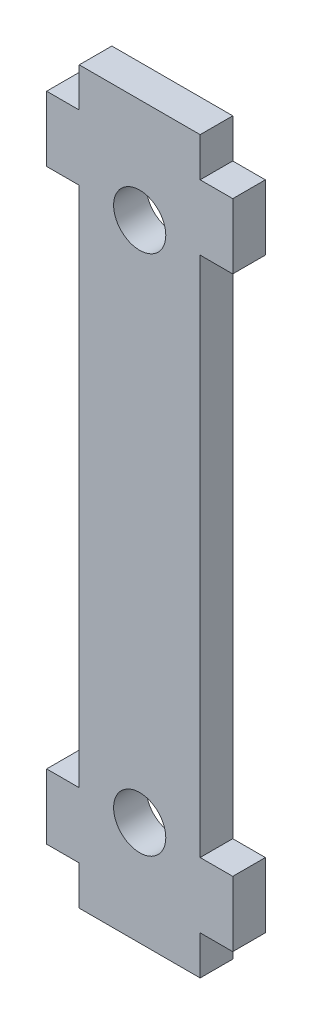
ISO-10303-21;
HEADER;
FILE_DESCRIPTION(('STEP AP214'),'2;1');
FILE_NAME('part.step','',(''),(''),'','','');
FILE_SCHEMA(('AUTOMOTIVE_DESIGN { 1 0 10303 214 1 1 1 1 }'));
ENDSEC;
DATA;
#1=APPLICATION_CONTEXT('core data for automotive mechanical design processes');
#2=APPLICATION_PROTOCOL_DEFINITION('international standard','automotive_design',2000,#1);
#3=PRODUCT_CONTEXT('',#1,'mechanical');
#4=PRODUCT('Part','Part','',(#3));
#5=PRODUCT_RELATED_PRODUCT_CATEGORY('part','',(#4));
#6=PRODUCT_DEFINITION_FORMATION('','',#4);
#7=PRODUCT_DEFINITION_CONTEXT('part definition',#1,'design');
#8=PRODUCT_DEFINITION('design','',#6,#7);
#9=PRODUCT_DEFINITION_SHAPE('','',#8);
#10=(LENGTH_UNIT() NAMED_UNIT(*) SI_UNIT(.MILLI.,.METRE.));
#11=(NAMED_UNIT(*) PLANE_ANGLE_UNIT() SI_UNIT($,.RADIAN.));
#12=(NAMED_UNIT(*) SI_UNIT($,.STERADIAN.) SOLID_ANGLE_UNIT());
#13=UNCERTAINTY_MEASURE_WITH_UNIT(LENGTH_MEASURE(1.E-05),#10,'distance_accuracy_value','');
#14=(GEOMETRIC_REPRESENTATION_CONTEXT(3) GLOBAL_UNCERTAINTY_ASSIGNED_CONTEXT((#13)) GLOBAL_UNIT_ASSIGNED_CONTEXT((#10,
#11,#12)) REPRESENTATION_CONTEXT('',''));
#15=CARTESIAN_POINT('',(0.,0.,0.));
#16=DIRECTION('',(0.,0.,1.));
#17=DIRECTION('',(1.,0.,0.));
#18=AXIS2_PLACEMENT_3D('',#15,#16,#17);
#19=CARTESIAN_POINT('',(0.,40.,2.5));
#20=DIRECTION('',(0.,-1.,0.));
#21=DIRECTION('',(0.,0.,-1.));
#22=AXIS2_PLACEMENT_3D('',#19,#20,#21);
#23=PLANE('',#22);
#24=DIRECTION('',(-1.,0.,0.));
#25=VECTOR('',#24,1.);
#26=CARTESIAN_POINT('',(0.,40.,-2.5));
#27=LINE('',#26,#25);
#28=CARTESIAN_POINT('',(-9.26999999999999,40.,-2.5));
#29=VERTEX_POINT('',#28);
#30=CARTESIAN_POINT('',(-14.27,40.,-2.5));
#31=VERTEX_POINT('',#30);
#32=EDGE_CURVE('E207',#29,#31,#27,.T.);
#33=ORIENTED_EDGE('',*,*,#32,.F.);
#34=DIRECTION('',(0.,0.,-1.));
#35=VECTOR('',#34,1.);
#36=CARTESIAN_POINT('',(-9.26999999999999,40.,2.5));
#37=LINE('',#36,#35);
#38=CARTESIAN_POINT('',(-9.26999999999999,40.,2.5));
#39=VERTEX_POINT('',#38);
#40=EDGE_CURVE('E11',#39,#29,#37,.T.);
#41=ORIENTED_EDGE('',*,*,#40,.F.);
#42=DIRECTION('',(-1.,0.,0.));
#43=VECTOR('',#42,1.);
#44=CARTESIAN_POINT('',(0.,40.,2.5));
#45=LINE('',#44,#43);
#46=CARTESIAN_POINT('',(-14.27,40.,2.5));
#47=VERTEX_POINT('',#46);
#48=EDGE_CURVE('E256',#39,#47,#45,.T.);
#49=ORIENTED_EDGE('',*,*,#48,.T.);
#50=DIRECTION('',(0.,0.,-1.));
#51=VECTOR('',#50,1.);
#52=CARTESIAN_POINT('',(-14.27,40.,2.5));
#53=LINE('',#52,#51);
#54=EDGE_CURVE('E57',#47,#31,#53,.T.);
#55=ORIENTED_EDGE('',*,*,#54,.T.);
#56=EDGE_LOOP('',(#33,#41,#49,#55));
#57=FACE_BOUND('',#56,.T.);
#58=ADVANCED_FACE('F41',(#57),#23,.T.);
#59=CARTESIAN_POINT('',(-9.26999999999999,0.,2.5));
#60=DIRECTION('',(1.,0.,0.));
#61=DIRECTION('',(0.,0.,-1.));
#62=AXIS2_PLACEMENT_3D('',#59,#60,#61);
#63=PLANE('',#62);
#64=DIRECTION('',(0.,-1.,0.));
#65=VECTOR('',#64,1.);
#66=CARTESIAN_POINT('',(-9.26999999999999,0.,-2.5));
#67=LINE('',#66,#65);
#68=CARTESIAN_POINT('',(-9.26999999999999,-40.,-2.5));
#69=VERTEX_POINT('',#68);
#70=EDGE_CURVE('E209',#29,#69,#67,.T.);
#71=ORIENTED_EDGE('',*,*,#70,.T.);
#72=DIRECTION('',(0.,0.,-1.));
#73=VECTOR('',#72,1.);
#74=CARTESIAN_POINT('',(-9.26999999999999,-40.,2.5));
#75=LINE('',#74,#73);
#76=CARTESIAN_POINT('',(-9.26999999999999,-40.,2.5));
#77=VERTEX_POINT('',#76);
#78=EDGE_CURVE('E49',#77,#69,#75,.T.);
#79=ORIENTED_EDGE('',*,*,#78,.F.);
#80=DIRECTION('',(0.,-1.,0.));
#81=VECTOR('',#80,1.);
#82=CARTESIAN_POINT('',(-9.26999999999999,0.,2.5));
#83=LINE('',#82,#81);
#84=EDGE_CURVE('E318',#39,#77,#83,.T.);
#85=ORIENTED_EDGE('',*,*,#84,.F.);
#86=ORIENTED_EDGE('',*,*,#40,.T.);
#87=EDGE_LOOP('',(#71,#79,#85,#86));
#88=FACE_BOUND('',#87,.T.);
#89=ADVANCED_FACE('F368',(#88),#63,.F.);
#90=CARTESIAN_POINT('',(0.,-40.,2.5));
#91=DIRECTION('',(0.,-1.,0.));
#92=DIRECTION('',(0.,0.,-1.));
#93=AXIS2_PLACEMENT_3D('',#90,#91,#92);
#94=PLANE('',#93);
#95=DIRECTION('',(-1.,0.,0.));
#96=VECTOR('',#95,1.);
#97=CARTESIAN_POINT('',(0.,-40.,-2.5));
#98=LINE('',#97,#96);
#99=CARTESIAN_POINT('',(-14.27,-40.,-2.5));
#100=VERTEX_POINT('',#99);
#101=EDGE_CURVE('E212',#69,#100,#98,.T.);
#102=ORIENTED_EDGE('',*,*,#101,.T.);
#103=DIRECTION('',(0.,0.,-1.));
#104=VECTOR('',#103,1.);
#105=CARTESIAN_POINT('',(-14.27,-40.,2.5));
#106=LINE('',#105,#104);
#107=CARTESIAN_POINT('',(-14.27,-40.,2.5));
#108=VERTEX_POINT('',#107);
#109=EDGE_CURVE('E292',#108,#100,#106,.T.);
#110=ORIENTED_EDGE('',*,*,#109,.F.);
#111=DIRECTION('',(-1.,0.,0.));
#112=VECTOR('',#111,1.);
#113=CARTESIAN_POINT('',(0.,-40.,2.5));
#114=LINE('',#113,#112);
#115=EDGE_CURVE('E300',#77,#108,#114,.T.);
#116=ORIENTED_EDGE('',*,*,#115,.F.);
#117=ORIENTED_EDGE('',*,*,#78,.T.);
#118=EDGE_LOOP('',(#102,#110,#116,#117));
#119=FACE_BOUND('',#118,.T.);
#120=ADVANCED_FACE('F298',(#119),#94,.F.);
#121=CARTESIAN_POINT('',(-14.2700000000001,0.,2.5));
#122=DIRECTION('',(-1.,0.,0.));
#123=DIRECTION('',(0.,-1.,0.));
#124=AXIS2_PLACEMENT_3D('',#121,#122,#123);
#125=PLANE('',#124);
#126=DIRECTION('',(0.,1.,0.));
#127=VECTOR('',#126,1.);
#128=CARTESIAN_POINT('',(-14.2700000000001,0.,-2.5));
#129=LINE('',#128,#127);
#130=CARTESIAN_POINT('',(-14.27,-50.,-2.5));
#131=VERTEX_POINT('',#130);
#132=EDGE_CURVE('E215',#131,#100,#129,.T.);
#133=ORIENTED_EDGE('',*,*,#132,.F.);
#134=DIRECTION('',(0.,0.,-1.));
#135=VECTOR('',#134,1.);
#136=CARTESIAN_POINT('',(-14.27,-50.,2.5));
#137=LINE('',#136,#135);
#138=CARTESIAN_POINT('',(-14.27,-50.,2.5));
#139=VERTEX_POINT('',#138);
#140=EDGE_CURVE('E290',#139,#131,#137,.T.);
#141=ORIENTED_EDGE('',*,*,#140,.F.);
#142=DIRECTION('',(0.,1.,0.));
#143=VECTOR('',#142,1.);
#144=CARTESIAN_POINT('',(-14.2700000000001,0.,2.5));
#145=LINE('',#144,#143);
#146=EDGE_CURVE('E313',#139,#108,#145,.T.);
#147=ORIENTED_EDGE('',*,*,#146,.T.);
#148=ORIENTED_EDGE('',*,*,#109,.T.);
#149=EDGE_LOOP('',(#133,#141,#147,#148));
#150=FACE_BOUND('',#149,.T.);
#151=ADVANCED_FACE('F309',(#150),#125,.T.);
#152=CARTESIAN_POINT('',(0.,-50.,2.5));
#153=DIRECTION('',(0.,1.,0.));
#154=DIRECTION('',(0.,0.,1.));
#155=AXIS2_PLACEMENT_3D('',#152,#153,#154);
#156=PLANE('',#155);
#157=DIRECTION('',(1.,0.,0.));
#158=VECTOR('',#157,1.);
#159=CARTESIAN_POINT('',(0.,-50.,-2.5));
#160=LINE('',#159,#158);
#161=CARTESIAN_POINT('',(-9.26999999999998,-50.,-2.5));
#162=VERTEX_POINT('',#161);
#163=EDGE_CURVE('E218',#131,#162,#160,.T.);
#164=ORIENTED_EDGE('',*,*,#163,.T.);
#165=DIRECTION('',(0.,0.,-1.));
#166=VECTOR('',#165,1.);
#167=CARTESIAN_POINT('',(-9.26999999999998,-50.,2.5));
#168=LINE('',#167,#166);
#169=CARTESIAN_POINT('',(-9.26999999999998,-50.,2.5));
#170=VERTEX_POINT('',#169);
#171=EDGE_CURVE('E287',#170,#162,#168,.T.);
#172=ORIENTED_EDGE('',*,*,#171,.F.);
#173=DIRECTION('',(1.,0.,0.));
#174=VECTOR('',#173,1.);
#175=CARTESIAN_POINT('',(0.,-50.,2.5));
#176=LINE('',#175,#174);
#177=EDGE_CURVE('E314',#139,#170,#176,.T.);
#178=ORIENTED_EDGE('',*,*,#177,.F.);
#179=ORIENTED_EDGE('',*,*,#140,.T.);
#180=EDGE_LOOP('',(#164,#172,#178,#179));
#181=FACE_BOUND('',#180,.T.);
#182=ADVANCED_FACE('F379',(#181),#156,.F.);
#183=CARTESIAN_POINT('',(-9.26999999999988,0.,2.5));
#184=DIRECTION('',(1.,0.,0.));
#185=DIRECTION('',(0.,1.,0.));
#186=AXIS2_PLACEMENT_3D('',#183,#184,#185);
#187=PLANE('',#186);
#188=DIRECTION('',(0.,-1.,0.));
#189=VECTOR('',#188,1.);
#190=CARTESIAN_POINT('',(-9.26999999999988,0.,-2.5));
#191=LINE('',#190,#189);
#192=CARTESIAN_POINT('',(-9.27,-56.,-2.5));
#193=VERTEX_POINT('',#192);
#194=EDGE_CURVE('E220',#162,#193,#191,.T.);
#195=ORIENTED_EDGE('',*,*,#194,.T.);
#196=DIRECTION('',(0.,0.,-1.));
#197=VECTOR('',#196,1.);
#198=CARTESIAN_POINT('',(-9.27,-56.,2.5));
#199=LINE('',#198,#197);
#200=CARTESIAN_POINT('',(-9.27,-56.,2.5));
#201=VERTEX_POINT('',#200);
#202=EDGE_CURVE('E285',#201,#193,#199,.T.);
#203=ORIENTED_EDGE('',*,*,#202,.F.);
#204=DIRECTION('',(0.,-1.,0.));
#205=VECTOR('',#204,1.);
#206=CARTESIAN_POINT('',(-9.26999999999988,0.,2.5));
#207=LINE('',#206,#205);
#208=EDGE_CURVE('E316',#170,#201,#207,.T.);
#209=ORIENTED_EDGE('',*,*,#208,.F.);
#210=ORIENTED_EDGE('',*,*,#171,.T.);
#211=EDGE_LOOP('',(#195,#203,#209,#210));
#212=FACE_BOUND('',#211,.T.);
#213=ADVANCED_FACE('F382',(#212),#187,.F.);
#214=CARTESIAN_POINT('',(0.,-56.,2.5));
#215=DIRECTION('',(0.,-1.,0.));
#216=DIRECTION('',(0.,0.,-1.));
#217=AXIS2_PLACEMENT_3D('',#214,#215,#216);
#218=PLANE('',#217);
#219=DIRECTION('',(-1.,0.,0.));
#220=VECTOR('',#219,1.);
#221=CARTESIAN_POINT('',(0.,-56.,-2.5));
#222=LINE('',#221,#220);
#223=CARTESIAN_POINT('',(9.27000000000002,-56.,-2.5));
#224=VERTEX_POINT('',#223);
#225=EDGE_CURVE('E223',#224,#193,#222,.T.);
#226=ORIENTED_EDGE('',*,*,#225,.F.);
#227=DIRECTION('',(0.,0.,-1.));
#228=VECTOR('',#227,1.);
#229=CARTESIAN_POINT('',(9.27000000000002,-56.,2.5));
#230=LINE('',#229,#228);
#231=CARTESIAN_POINT('',(9.27000000000002,-56.,2.5));
#232=VERTEX_POINT('',#231);
#233=EDGE_CURVE('E283',#232,#224,#230,.T.);
#234=ORIENTED_EDGE('',*,*,#233,.F.);
#235=DIRECTION('',(-1.,0.,0.));
#236=VECTOR('',#235,1.);
#237=CARTESIAN_POINT('',(0.,-56.,2.5));
#238=LINE('',#237,#236);
#239=EDGE_CURVE('E323',#232,#201,#238,.T.);
#240=ORIENTED_EDGE('',*,*,#239,.T.);
#241=ORIENTED_EDGE('',*,*,#202,.T.);
#242=EDGE_LOOP('',(#226,#234,#240,#241));
#243=FACE_BOUND('',#242,.T.);
#244=ADVANCED_FACE('F386',(#243),#218,.T.);
#245=CARTESIAN_POINT('',(9.26999999999965,0.,2.5));
#246=DIRECTION('',(1.,0.,0.));
#247=DIRECTION('',(0.,1.,0.));
#248=AXIS2_PLACEMENT_3D('',#245,#246,#247);
#249=PLANE('',#248);
#250=DIRECTION('',(0.,-1.,0.));
#251=VECTOR('',#250,1.);
#252=CARTESIAN_POINT('',(9.26999999999965,0.,-2.5));
#253=LINE('',#252,#251);
#254=CARTESIAN_POINT('',(9.26999999999998,-50.,-2.5));
#255=VERTEX_POINT('',#254);
#256=EDGE_CURVE('E226',#255,#224,#253,.T.);
#257=ORIENTED_EDGE('',*,*,#256,.F.);
#258=DIRECTION('',(0.,0.,-1.));
#259=VECTOR('',#258,1.);
#260=CARTESIAN_POINT('',(9.26999999999998,-50.,2.5));
#261=LINE('',#260,#259);
#262=CARTESIAN_POINT('',(9.26999999999998,-50.,2.5));
#263=VERTEX_POINT('',#262);
#264=EDGE_CURVE('E281',#263,#255,#261,.T.);
#265=ORIENTED_EDGE('',*,*,#264,.F.);
#266=DIRECTION('',(0.,-1.,0.));
#267=VECTOR('',#266,1.);
#268=CARTESIAN_POINT('',(9.26999999999965,0.,2.5));
#269=LINE('',#268,#267);
#270=EDGE_CURVE('E326',#263,#232,#269,.T.);
#271=ORIENTED_EDGE('',*,*,#270,.T.);
#272=ORIENTED_EDGE('',*,*,#233,.T.);
#273=EDGE_LOOP('',(#257,#265,#271,#272));
#274=FACE_BOUND('',#273,.T.);
#275=ADVANCED_FACE('F390',(#274),#249,.T.);
#276=CARTESIAN_POINT('',(0.,-50.,2.5));
#277=DIRECTION('',(0.,-1.,0.));
#278=DIRECTION('',(1.,0.,0.));
#279=AXIS2_PLACEMENT_3D('',#276,#277,#278);
#280=PLANE('',#279);
#281=DIRECTION('',(-1.,0.,0.));
#282=VECTOR('',#281,1.);
#283=CARTESIAN_POINT('',(0.,-50.,-2.5));
#284=LINE('',#283,#282);
#285=CARTESIAN_POINT('',(14.27,-50.,-2.5));
#286=VERTEX_POINT('',#285);
#287=EDGE_CURVE('E229',#286,#255,#284,.T.);
#288=ORIENTED_EDGE('',*,*,#287,.F.);
#289=DIRECTION('',(0.,0.,-1.));
#290=VECTOR('',#289,1.);
#291=CARTESIAN_POINT('',(14.27,-50.,2.5));
#292=LINE('',#291,#290);
#293=CARTESIAN_POINT('',(14.27,-50.,2.5));
#294=VERTEX_POINT('',#293);
#295=EDGE_CURVE('E279',#294,#286,#292,.T.);
#296=ORIENTED_EDGE('',*,*,#295,.F.);
#297=DIRECTION('',(-1.,0.,0.));
#298=VECTOR('',#297,1.);
#299=CARTESIAN_POINT('',(0.,-50.,2.5));
#300=LINE('',#299,#298);
#301=EDGE_CURVE('E329',#294,#263,#300,.T.);
#302=ORIENTED_EDGE('',*,*,#301,.T.);
#303=ORIENTED_EDGE('',*,*,#264,.T.);
#304=EDGE_LOOP('',(#288,#296,#302,#303));
#305=FACE_BOUND('',#304,.T.);
#306=ADVANCED_FACE('F394',(#305),#280,.T.);
#307=CARTESIAN_POINT('',(14.2700000000002,0.,2.5));
#308=DIRECTION('',(-1.,0.,0.));
#309=DIRECTION('',(0.,-1.,0.));
#310=AXIS2_PLACEMENT_3D('',#307,#308,#309);
#311=PLANE('',#310);
#312=DIRECTION('',(0.,1.,0.));
#313=VECTOR('',#312,1.);
#314=CARTESIAN_POINT('',(14.2700000000002,0.,-2.5));
#315=LINE('',#314,#313);
#316=CARTESIAN_POINT('',(14.27,-40.,-2.5));
#317=VERTEX_POINT('',#316);
#318=EDGE_CURVE('E232',#286,#317,#315,.T.);
#319=ORIENTED_EDGE('',*,*,#318,.T.);
#320=DIRECTION('',(0.,0.,-1.));
#321=VECTOR('',#320,1.);
#322=CARTESIAN_POINT('',(14.27,-40.,2.5));
#323=LINE('',#322,#321);
#324=CARTESIAN_POINT('',(14.27,-40.,2.5));
#325=VERTEX_POINT('',#324);
#326=EDGE_CURVE('E277',#325,#317,#323,.T.);
#327=ORIENTED_EDGE('',*,*,#326,.F.);
#328=DIRECTION('',(0.,1.,0.));
#329=VECTOR('',#328,1.);
#330=CARTESIAN_POINT('',(14.2700000000002,0.,2.5));
#331=LINE('',#330,#329);
#332=EDGE_CURVE('E332',#294,#325,#331,.T.);
#333=ORIENTED_EDGE('',*,*,#332,.F.);
#334=ORIENTED_EDGE('',*,*,#295,.T.);
#335=EDGE_LOOP('',(#319,#327,#333,#334));
#336=FACE_BOUND('',#335,.T.);
#337=ADVANCED_FACE('F398',(#336),#311,.F.);
#338=CARTESIAN_POINT('',(0.,-40.,2.5));
#339=DIRECTION('',(0.,1.,0.));
#340=DIRECTION('',(-1.,0.,0.));
#341=AXIS2_PLACEMENT_3D('',#338,#339,#340);
#342=PLANE('',#341);
#343=DIRECTION('',(1.,0.,0.));
#344=VECTOR('',#343,1.);
#345=CARTESIAN_POINT('',(0.,-40.,-2.5));
#346=LINE('',#345,#344);
#347=CARTESIAN_POINT('',(9.26999999999999,-40.,-2.5));
#348=VERTEX_POINT('',#347);
#349=EDGE_CURVE('E235',#348,#317,#346,.T.);
#350=ORIENTED_EDGE('',*,*,#349,.F.);
#351=DIRECTION('',(0.,0.,-1.));
#352=VECTOR('',#351,1.);
#353=CARTESIAN_POINT('',(9.26999999999999,-40.,2.5));
#354=LINE('',#353,#352);
#355=CARTESIAN_POINT('',(9.26999999999999,-40.,2.5));
#356=VERTEX_POINT('',#355);
#357=EDGE_CURVE('E275',#356,#348,#354,.T.);
#358=ORIENTED_EDGE('',*,*,#357,.F.);
#359=DIRECTION('',(1.,0.,0.));
#360=VECTOR('',#359,1.);
#361=CARTESIAN_POINT('',(0.,-40.,2.5));
#362=LINE('',#361,#360);
#363=EDGE_CURVE('E334',#356,#325,#362,.T.);
#364=ORIENTED_EDGE('',*,*,#363,.T.);
#365=ORIENTED_EDGE('',*,*,#326,.T.);
#366=EDGE_LOOP('',(#350,#358,#364,#365));
#367=FACE_BOUND('',#366,.T.);
#368=ADVANCED_FACE('F402',(#367),#342,.T.);
#369=CARTESIAN_POINT('',(9.26999999999999,0.,2.5));
#370=DIRECTION('',(-1.,0.,0.));
#371=DIRECTION('',(0.,0.,1.));
#372=AXIS2_PLACEMENT_3D('',#369,#370,#371);
#373=PLANE('',#372);
#374=DIRECTION('',(0.,1.,0.));
#375=VECTOR('',#374,1.);
#376=CARTESIAN_POINT('',(9.26999999999999,0.,-2.5));
#377=LINE('',#376,#375);
#378=CARTESIAN_POINT('',(9.26999999999999,40.,-2.5));
#379=VERTEX_POINT('',#378);
#380=EDGE_CURVE('E238',#348,#379,#377,.T.);
#381=ORIENTED_EDGE('',*,*,#380,.T.);
#382=DIRECTION('',(0.,0.,-1.));
#383=VECTOR('',#382,1.);
#384=CARTESIAN_POINT('',(9.26999999999999,40.,2.5));
#385=LINE('',#384,#383);
#386=CARTESIAN_POINT('',(9.26999999999999,40.,2.5));
#387=VERTEX_POINT('',#386);
#388=EDGE_CURVE('E272',#387,#379,#385,.T.);
#389=ORIENTED_EDGE('',*,*,#388,.F.);
#390=DIRECTION('',(0.,1.,0.));
#391=VECTOR('',#390,1.);
#392=CARTESIAN_POINT('',(9.26999999999999,0.,2.5));
#393=LINE('',#392,#391);
#394=EDGE_CURVE('E337',#356,#387,#393,.T.);
#395=ORIENTED_EDGE('',*,*,#394,.F.);
#396=ORIENTED_EDGE('',*,*,#357,.T.);
#397=EDGE_LOOP('',(#381,#389,#395,#396));
#398=FACE_BOUND('',#397,.T.);
#399=ADVANCED_FACE('F406',(#398),#373,.F.);
#400=CARTESIAN_POINT('',(0.,40.,2.5));
#401=DIRECTION('',(0.,1.,0.));
#402=DIRECTION('',(0.,0.,1.));
#403=AXIS2_PLACEMENT_3D('',#400,#401,#402);
#404=PLANE('',#403);
#405=DIRECTION('',(1.,0.,0.));
#406=VECTOR('',#405,1.);
#407=CARTESIAN_POINT('',(0.,40.,-2.5));
#408=LINE('',#407,#406);
#409=CARTESIAN_POINT('',(14.27,40.,-2.5));
#410=VERTEX_POINT('',#409);
#411=EDGE_CURVE('E240',#379,#410,#408,.T.);
#412=ORIENTED_EDGE('',*,*,#411,.T.);
#413=DIRECTION('',(0.,0.,-1.));
#414=VECTOR('',#413,1.);
#415=CARTESIAN_POINT('',(14.27,40.,2.5));
#416=LINE('',#415,#414);
#417=CARTESIAN_POINT('',(14.27,40.,2.5));
#418=VERTEX_POINT('',#417);
#419=EDGE_CURVE('E269',#418,#410,#416,.T.);
#420=ORIENTED_EDGE('',*,*,#419,.F.);
#421=DIRECTION('',(1.,0.,0.));
#422=VECTOR('',#421,1.);
#423=CARTESIAN_POINT('',(0.,40.,2.5));
#424=LINE('',#423,#422);
#425=EDGE_CURVE('E339',#387,#418,#424,.T.);
#426=ORIENTED_EDGE('',*,*,#425,.F.);
#427=ORIENTED_EDGE('',*,*,#388,.T.);
#428=EDGE_LOOP('',(#412,#420,#426,#427));
#429=FACE_BOUND('',#428,.T.);
#430=ADVANCED_FACE('F410',(#429),#404,.F.);
#431=CARTESIAN_POINT('',(14.2700000000002,0.,2.5));
#432=DIRECTION('',(-1.,0.,0.));
#433=DIRECTION('',(0.,-1.,0.));
#434=AXIS2_PLACEMENT_3D('',#431,#432,#433);
#435=PLANE('',#434);
#436=DIRECTION('',(0.,1.,0.));
#437=VECTOR('',#436,1.);
#438=CARTESIAN_POINT('',(14.2700000000002,0.,-2.5));
#439=LINE('',#438,#437);
#440=CARTESIAN_POINT('',(14.27,50.,-2.5));
#441=VERTEX_POINT('',#440);
#442=EDGE_CURVE('E242',#410,#441,#439,.T.);
#443=ORIENTED_EDGE('',*,*,#442,.T.);
#444=DIRECTION('',(0.,0.,-1.));
#445=VECTOR('',#444,1.);
#446=CARTESIAN_POINT('',(14.27,50.,2.5));
#447=LINE('',#446,#445);
#448=CARTESIAN_POINT('',(14.27,50.,2.5));
#449=VERTEX_POINT('',#448);
#450=EDGE_CURVE('E266',#449,#441,#447,.T.);
#451=ORIENTED_EDGE('',*,*,#450,.F.);
#452=DIRECTION('',(0.,1.,0.));
#453=VECTOR('',#452,1.);
#454=CARTESIAN_POINT('',(14.2700000000002,0.,2.5));
#455=LINE('',#454,#453);
#456=EDGE_CURVE('E341',#418,#449,#455,.T.);
#457=ORIENTED_EDGE('',*,*,#456,.F.);
#458=ORIENTED_EDGE('',*,*,#419,.T.);
#459=EDGE_LOOP('',(#443,#451,#457,#458));
#460=FACE_BOUND('',#459,.T.);
#461=ADVANCED_FACE('F414',(#460),#435,.F.);
#462=CARTESIAN_POINT('',(-1.38777878078144E-13,50.,2.5));
#463=DIRECTION('',(0.,-1.,0.));
#464=DIRECTION('',(1.,0.,0.));
#465=AXIS2_PLACEMENT_3D('',#462,#463,#464);
#466=PLANE('',#465);
#467=DIRECTION('',(-1.,0.,0.));
#468=VECTOR('',#467,1.);
#469=CARTESIAN_POINT('',(-1.38777878078144E-13,50.,-2.5));
#470=LINE('',#469,#468);
#471=CARTESIAN_POINT('',(9.26999999999998,50.,-2.5));
#472=VERTEX_POINT('',#471);
#473=EDGE_CURVE('E244',#441,#472,#470,.T.);
#474=ORIENTED_EDGE('',*,*,#473,.T.);
#475=DIRECTION('',(0.,0.,-1.));
#476=VECTOR('',#475,1.);
#477=CARTESIAN_POINT('',(9.26999999999998,50.,2.5));
#478=LINE('',#477,#476);
#479=CARTESIAN_POINT('',(9.26999999999998,50.,2.5));
#480=VERTEX_POINT('',#479);
#481=EDGE_CURVE('E263',#480,#472,#478,.T.);
#482=ORIENTED_EDGE('',*,*,#481,.F.);
#483=DIRECTION('',(-1.,0.,0.));
#484=VECTOR('',#483,1.);
#485=CARTESIAN_POINT('',(-1.38777878078144E-13,50.,2.5));
#486=LINE('',#485,#484);
#487=EDGE_CURVE('E343',#449,#480,#486,.T.);
#488=ORIENTED_EDGE('',*,*,#487,.F.);
#489=ORIENTED_EDGE('',*,*,#450,.T.);
#490=EDGE_LOOP('',(#474,#482,#488,#489));
#491=FACE_BOUND('',#490,.T.);
#492=ADVANCED_FACE('F418',(#491),#466,.F.);
#493=CARTESIAN_POINT('',(9.26999999999978,0.,2.5));
#494=DIRECTION('',(-1.,0.,0.));
#495=DIRECTION('',(0.,-1.,0.));
#496=AXIS2_PLACEMENT_3D('',#493,#494,#495);
#497=PLANE('',#496);
#498=DIRECTION('',(0.,1.,0.));
#499=VECTOR('',#498,1.);
#500=CARTESIAN_POINT('',(9.26999999999978,0.,-2.5));
#501=LINE('',#500,#499);
#502=CARTESIAN_POINT('',(9.27000000000001,56.,-2.5));
#503=VERTEX_POINT('',#502);
#504=EDGE_CURVE('E246',#472,#503,#501,.T.);
#505=ORIENTED_EDGE('',*,*,#504,.T.);
#506=DIRECTION('',(0.,0.,-1.));
#507=VECTOR('',#506,1.);
#508=CARTESIAN_POINT('',(9.27000000000001,56.,2.5));
#509=LINE('',#508,#507);
#510=CARTESIAN_POINT('',(9.27000000000001,56.,2.5));
#511=VERTEX_POINT('',#510);
#512=EDGE_CURVE('E260',#511,#503,#509,.T.);
#513=ORIENTED_EDGE('',*,*,#512,.F.);
#514=DIRECTION('',(0.,1.,0.));
#515=VECTOR('',#514,1.);
#516=CARTESIAN_POINT('',(9.26999999999978,0.,2.5));
#517=LINE('',#516,#515);
#518=EDGE_CURVE('E345',#480,#511,#517,.T.);
#519=ORIENTED_EDGE('',*,*,#518,.F.);
#520=ORIENTED_EDGE('',*,*,#481,.T.);
#521=EDGE_LOOP('',(#505,#513,#519,#520));
#522=FACE_BOUND('',#521,.T.);
#523=ADVANCED_FACE('F351',(#522),#497,.F.);
#524=CARTESIAN_POINT('',(0.,56.,2.5));
#525=DIRECTION('',(0.,-1.,0.));
#526=DIRECTION('',(0.,0.,-1.));
#527=AXIS2_PLACEMENT_3D('',#524,#525,#526);
#528=PLANE('',#527);
#529=DIRECTION('',(-1.,0.,0.));
#530=VECTOR('',#529,1.);
#531=CARTESIAN_POINT('',(0.,56.,-2.5));
#532=LINE('',#531,#530);
#533=CARTESIAN_POINT('',(-9.27000000000001,56.,-2.5));
#534=VERTEX_POINT('',#533);
#535=EDGE_CURVE('E248',#503,#534,#532,.T.);
#536=ORIENTED_EDGE('',*,*,#535,.T.);
#537=DIRECTION('',(0.,0.,-1.));
#538=VECTOR('',#537,1.);
#539=CARTESIAN_POINT('',(-9.27000000000001,56.,2.5));
#540=LINE('',#539,#538);
#541=CARTESIAN_POINT('',(-9.27000000000001,56.,2.5));
#542=VERTEX_POINT('',#541);
#543=EDGE_CURVE('E199',#542,#534,#540,.T.);
#544=ORIENTED_EDGE('',*,*,#543,.F.);
#545=DIRECTION('',(-1.,0.,0.));
#546=VECTOR('',#545,1.);
#547=CARTESIAN_POINT('',(0.,56.,2.5));
#548=LINE('',#547,#546);
#549=EDGE_CURVE('E187',#511,#542,#548,.T.);
#550=ORIENTED_EDGE('',*,*,#549,.F.);
#551=ORIENTED_EDGE('',*,*,#512,.T.);
#552=EDGE_LOOP('',(#536,#544,#550,#551));
#553=FACE_BOUND('',#552,.T.);
#554=ADVANCED_FACE('F355',(#553),#528,.F.);
#555=CARTESIAN_POINT('',(-9.26999999999978,0.,2.5));
#556=DIRECTION('',(1.,0.,0.));
#557=DIRECTION('',(0.,1.,0.));
#558=AXIS2_PLACEMENT_3D('',#555,#556,#557);
#559=PLANE('',#558);
#560=DIRECTION('',(0.,-1.,0.));
#561=VECTOR('',#560,1.);
#562=CARTESIAN_POINT('',(-9.26999999999978,0.,-2.5));
#563=LINE('',#562,#561);
#564=CARTESIAN_POINT('',(-9.26999999999998,50.,-2.5));
#565=VERTEX_POINT('',#564);
#566=EDGE_CURVE('E196',#534,#565,#563,.T.);
#567=ORIENTED_EDGE('',*,*,#566,.T.);
#568=DIRECTION('',(0.,0.,-1.));
#569=VECTOR('',#568,1.);
#570=CARTESIAN_POINT('',(-9.26999999999998,50.,2.5));
#571=LINE('',#570,#569);
#572=CARTESIAN_POINT('',(-9.26999999999998,50.,2.5));
#573=VERTEX_POINT('',#572);
#574=EDGE_CURVE('E193',#573,#565,#571,.T.);
#575=ORIENTED_EDGE('',*,*,#574,.F.);
#576=DIRECTION('',(0.,-1.,0.));
#577=VECTOR('',#576,1.);
#578=CARTESIAN_POINT('',(-9.26999999999978,0.,2.5));
#579=LINE('',#578,#577);
#580=EDGE_CURVE('E179',#542,#573,#579,.T.);
#581=ORIENTED_EDGE('',*,*,#580,.F.);
#582=ORIENTED_EDGE('',*,*,#543,.T.);
#583=EDGE_LOOP('',(#567,#575,#581,#582));
#584=FACE_BOUND('',#583,.T.);
#585=ADVANCED_FACE('F194',(#584),#559,.F.);
#586=CARTESIAN_POINT('',(0.,50.,2.5));
#587=DIRECTION('',(0.,1.,0.));
#588=DIRECTION('',(-1.,0.,0.));
#589=AXIS2_PLACEMENT_3D('',#586,#587,#588);
#590=PLANE('',#589);
#591=DIRECTION('',(1.,0.,0.));
#592=VECTOR('',#591,1.);
#593=CARTESIAN_POINT('',(0.,50.,-2.5));
#594=LINE('',#593,#592);
#595=CARTESIAN_POINT('',(-14.27,50.,-2.5));
#596=VERTEX_POINT('',#595);
#597=EDGE_CURVE('E251',#596,#565,#594,.T.);
#598=ORIENTED_EDGE('',*,*,#597,.F.);
#599=DIRECTION('',(0.,0.,-1.));
#600=VECTOR('',#599,1.);
#601=CARTESIAN_POINT('',(-14.27,50.,2.5));
#602=LINE('',#601,#600);
#603=CARTESIAN_POINT('',(-14.27,50.,2.5));
#604=VERTEX_POINT('',#603);
#605=EDGE_CURVE('E118',#604,#596,#602,.T.);
#606=ORIENTED_EDGE('',*,*,#605,.F.);
#607=DIRECTION('',(1.,0.,0.));
#608=VECTOR('',#607,1.);
#609=CARTESIAN_POINT('',(0.,50.,2.5));
#610=LINE('',#609,#608);
#611=EDGE_CURVE('E185',#604,#573,#610,.T.);
#612=ORIENTED_EDGE('',*,*,#611,.T.);
#613=ORIENTED_EDGE('',*,*,#574,.T.);
#614=EDGE_LOOP('',(#598,#606,#612,#613));
#615=FACE_BOUND('',#614,.T.);
#616=ADVANCED_FACE('F201',(#615),#590,.T.);
#617=CARTESIAN_POINT('',(-14.2700000000001,0.,2.5));
#618=DIRECTION('',(-1.,0.,0.));
#619=DIRECTION('',(0.,-1.,0.));
#620=AXIS2_PLACEMENT_3D('',#617,#618,#619);
#621=PLANE('',#620);
#622=DIRECTION('',(0.,1.,0.));
#623=VECTOR('',#622,1.);
#624=CARTESIAN_POINT('',(-14.2700000000001,0.,-2.5));
#625=LINE('',#624,#623);
#626=EDGE_CURVE('E253',#31,#596,#625,.T.);
#627=ORIENTED_EDGE('',*,*,#626,.F.);
#628=ORIENTED_EDGE('',*,*,#54,.F.);
#629=DIRECTION('',(0.,1.,0.));
#630=VECTOR('',#629,1.);
#631=CARTESIAN_POINT('',(-14.2700000000001,0.,2.5));
#632=LINE('',#631,#630);
#633=EDGE_CURVE('E202',#47,#604,#632,.T.);
#634=ORIENTED_EDGE('',*,*,#633,.T.);
#635=ORIENTED_EDGE('',*,*,#605,.T.);
#636=EDGE_LOOP('',(#627,#628,#634,#635));
#637=FACE_BOUND('',#636,.T.);
#638=ADVANCED_FACE('F356',(#637),#621,.T.);
#639=CARTESIAN_POINT('',(0.,0.,2.5));
#640=DIRECTION('',(0.,0.,1.));
#641=DIRECTION('',(1.,0.,0.));
#642=AXIS2_PLACEMENT_3D('',#639,#640,#641);
#643=PLANE('',#642);
#644=CARTESIAN_POINT('',(0.,40.,2.5));
#645=DIRECTION('',(0.,0.,1.));
#646=DIRECTION('',(1.,0.,0.));
#647=AXIS2_PLACEMENT_3D('',#644,#645,#646);
#648=CIRCLE('',#647,4.);
#649=CARTESIAN_POINT('',(3.99999999999999,40.,2.5));
#650=VERTEX_POINT('',#649);
#651=EDGE_CURVE('E484',#650,#650,#648,.T.);
#652=ORIENTED_EDGE('',*,*,#651,.F.);
#653=EDGE_LOOP('',(#652));
#654=FACE_BOUND('',#653,.T.);
#655=CARTESIAN_POINT('',(0.,-40.,2.5));
#656=DIRECTION('',(0.,0.,1.));
#657=DIRECTION('',(1.,0.,0.));
#658=AXIS2_PLACEMENT_3D('',#655,#656,#657);
#659=CIRCLE('',#658,4.);
#660=CARTESIAN_POINT('',(4.,-40.,2.5));
#661=VERTEX_POINT('',#660);
#662=EDGE_CURVE('E485',#661,#661,#659,.T.);
#663=ORIENTED_EDGE('',*,*,#662,.F.);
#664=EDGE_LOOP('',(#663));
#665=FACE_BOUND('',#664,.T.);
#666=ORIENTED_EDGE('',*,*,#48,.F.);
#667=ORIENTED_EDGE('',*,*,#84,.T.);
#668=ORIENTED_EDGE('',*,*,#115,.T.);
#669=ORIENTED_EDGE('',*,*,#146,.F.);
#670=ORIENTED_EDGE('',*,*,#177,.T.);
#671=ORIENTED_EDGE('',*,*,#208,.T.);
#672=ORIENTED_EDGE('',*,*,#239,.F.);
#673=ORIENTED_EDGE('',*,*,#270,.F.);
#674=ORIENTED_EDGE('',*,*,#301,.F.);
#675=ORIENTED_EDGE('',*,*,#332,.T.);
#676=ORIENTED_EDGE('',*,*,#363,.F.);
#677=ORIENTED_EDGE('',*,*,#394,.T.);
#678=ORIENTED_EDGE('',*,*,#425,.T.);
#679=ORIENTED_EDGE('',*,*,#456,.T.);
#680=ORIENTED_EDGE('',*,*,#487,.T.);
#681=ORIENTED_EDGE('',*,*,#518,.T.);
#682=ORIENTED_EDGE('',*,*,#549,.T.);
#683=ORIENTED_EDGE('',*,*,#580,.T.);
#684=ORIENTED_EDGE('',*,*,#611,.F.);
#685=ORIENTED_EDGE('',*,*,#633,.F.);
#686=EDGE_LOOP('',(#666,#667,#668,#669,#670,#671,#672,#673,#674,#675,#676,#677,#678,#679,#680,
#681,#682,#683,#684,#685));
#687=FACE_BOUND('',#686,.T.);
#688=ADVANCED_FACE('F182',(#654,#665,#687),#643,.T.);
#689=CARTESIAN_POINT('',(0.,0.,-2.5));
#690=DIRECTION('',(0.,0.,1.));
#691=DIRECTION('',(1.,0.,0.));
#692=AXIS2_PLACEMENT_3D('',#689,#690,#691);
#693=PLANE('',#692);
#694=CARTESIAN_POINT('',(0.,40.,-2.5));
#695=DIRECTION('',(0.,0.,1.));
#696=DIRECTION('',(1.,0.,0.));
#697=AXIS2_PLACEMENT_3D('',#694,#695,#696);
#698=CIRCLE('',#697,4.);
#699=CARTESIAN_POINT('',(3.99999999999999,40.,-2.5));
#700=VERTEX_POINT('',#699);
#701=EDGE_CURVE('E210',#700,#700,#698,.T.);
#702=ORIENTED_EDGE('',*,*,#701,.T.);
#703=EDGE_LOOP('',(#702));
#704=FACE_BOUND('',#703,.T.);
#705=CARTESIAN_POINT('',(0.,-40.,-2.5));
#706=DIRECTION('',(0.,0.,1.));
#707=DIRECTION('',(1.,0.,0.));
#708=AXIS2_PLACEMENT_3D('',#705,#706,#707);
#709=CIRCLE('',#708,4.);
#710=CARTESIAN_POINT('',(4.,-40.,-2.5));
#711=VERTEX_POINT('',#710);
#712=EDGE_CURVE('E489',#711,#711,#709,.T.);
#713=ORIENTED_EDGE('',*,*,#712,.T.);
#714=EDGE_LOOP('',(#713));
#715=FACE_BOUND('',#714,.T.);
#716=ORIENTED_EDGE('',*,*,#32,.T.);
#717=ORIENTED_EDGE('',*,*,#626,.T.);
#718=ORIENTED_EDGE('',*,*,#597,.T.);
#719=ORIENTED_EDGE('',*,*,#566,.F.);
#720=ORIENTED_EDGE('',*,*,#535,.F.);
#721=ORIENTED_EDGE('',*,*,#504,.F.);
#722=ORIENTED_EDGE('',*,*,#473,.F.);
#723=ORIENTED_EDGE('',*,*,#442,.F.);
#724=ORIENTED_EDGE('',*,*,#411,.F.);
#725=ORIENTED_EDGE('',*,*,#380,.F.);
#726=ORIENTED_EDGE('',*,*,#349,.T.);
#727=ORIENTED_EDGE('',*,*,#318,.F.);
#728=ORIENTED_EDGE('',*,*,#287,.T.);
#729=ORIENTED_EDGE('',*,*,#256,.T.);
#730=ORIENTED_EDGE('',*,*,#225,.T.);
#731=ORIENTED_EDGE('',*,*,#194,.F.);
#732=ORIENTED_EDGE('',*,*,#163,.F.);
#733=ORIENTED_EDGE('',*,*,#132,.T.);
#734=ORIENTED_EDGE('',*,*,#101,.F.);
#735=ORIENTED_EDGE('',*,*,#70,.F.);
#736=EDGE_LOOP('',(#716,#717,#718,#719,#720,#721,#722,#723,#724,#725,#726,#727,#728,#729,#730,
#731,#732,#733,#734,#735));
#737=FACE_BOUND('',#736,.T.);
#738=ADVANCED_FACE('F304',(#704,#715,#737),#693,.F.);
#739=CARTESIAN_POINT('',(0.,-40.,-2.5));
#740=DIRECTION('',(0.,0.,1.));
#741=DIRECTION('',(1.,0.,0.));
#742=AXIS2_PLACEMENT_3D('',#739,#740,#741);
#743=CYLINDRICAL_SURFACE('',#742,4.);
#744=ORIENTED_EDGE('',*,*,#712,.F.);
#745=EDGE_LOOP('',(#744));
#746=FACE_BOUND('',#745,.T.);
#747=ORIENTED_EDGE('',*,*,#662,.T.);
#748=EDGE_LOOP('',(#747));
#749=FACE_BOUND('',#748,.T.);
#750=ADVANCED_FACE('F457',(#746,#749),#743,.F.);
#751=CARTESIAN_POINT('',(0.,40.,-2.5));
#752=DIRECTION('',(0.,0.,1.));
#753=DIRECTION('',(1.,0.,0.));
#754=AXIS2_PLACEMENT_3D('',#751,#752,#753);
#755=CYLINDRICAL_SURFACE('',#754,4.);
#756=ORIENTED_EDGE('',*,*,#701,.F.);
#757=EDGE_LOOP('',(#756));
#758=FACE_BOUND('',#757,.T.);
#759=ORIENTED_EDGE('',*,*,#651,.T.);
#760=EDGE_LOOP('',(#759));
#761=FACE_BOUND('',#760,.T.);
#762=ADVANCED_FACE('F466',(#758,#761),#755,.F.);
#763=CLOSED_SHELL('',(#58,#89,#120,#151,#182,#213,#244,#275,#306,#337,#368,#399,#430,#461,#492,
#523,#554,#585,#616,#638,#688,#738,#750,#762));
#764=MANIFOLD_SOLID_BREP('B2',#763);
#765=ADVANCED_BREP_SHAPE_REPRESENTATION('',(#18,#764),#14);
#766=SHAPE_DEFINITION_REPRESENTATION(#9,#765);
ENDSEC;
END-ISO-10303-21;
